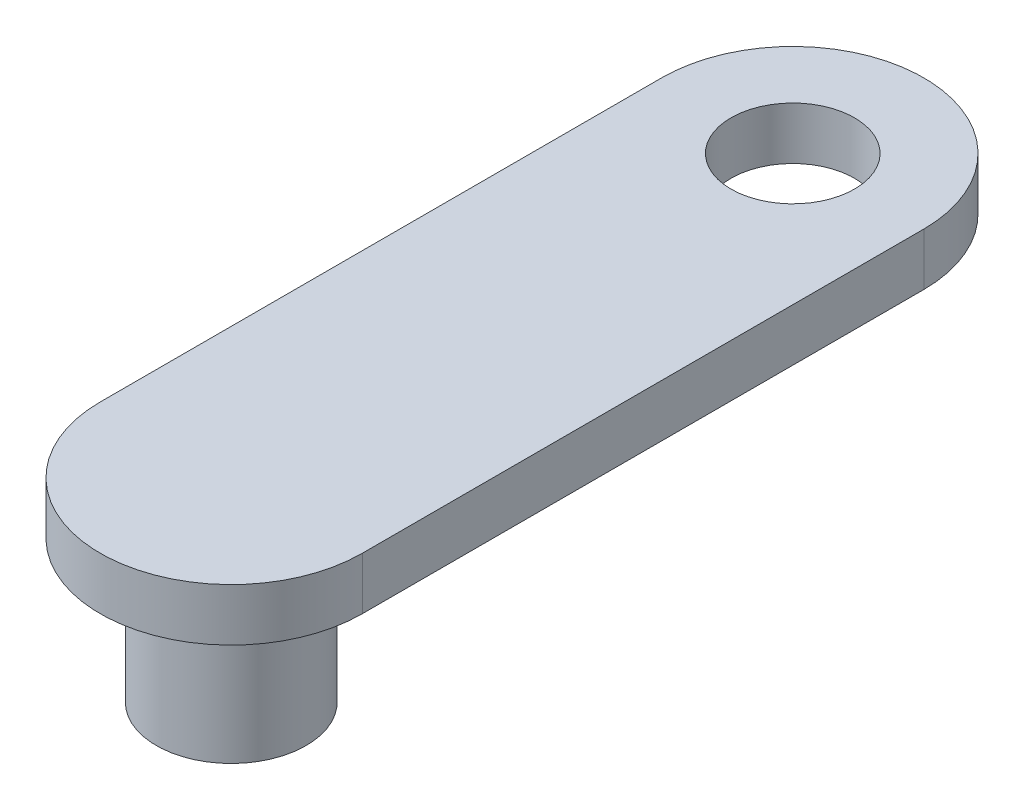
ISO-10303-21;
HEADER;
FILE_DESCRIPTION(('STEP AP214'),'2;1');
FILE_NAME('part.step','',(''),(''),'','','');
FILE_SCHEMA(('AUTOMOTIVE_DESIGN { 1 0 10303 214 1 1 1 1 }'));
ENDSEC;
DATA;
#1=APPLICATION_CONTEXT('core data for automotive mechanical design processes');
#2=APPLICATION_PROTOCOL_DEFINITION('international standard','automotive_design',2000,#1);
#3=PRODUCT_CONTEXT('',#1,'mechanical');
#4=PRODUCT('Part','Part','',(#3));
#5=PRODUCT_RELATED_PRODUCT_CATEGORY('part','',(#4));
#6=PRODUCT_DEFINITION_FORMATION('','',#4);
#7=PRODUCT_DEFINITION_CONTEXT('part definition',#1,'design');
#8=PRODUCT_DEFINITION('design','',#6,#7);
#9=PRODUCT_DEFINITION_SHAPE('','',#8);
#10=(LENGTH_UNIT() NAMED_UNIT(*) SI_UNIT(.MILLI.,.METRE.));
#11=(NAMED_UNIT(*) PLANE_ANGLE_UNIT() SI_UNIT($,.RADIAN.));
#12=(NAMED_UNIT(*) SI_UNIT($,.STERADIAN.) SOLID_ANGLE_UNIT());
#13=UNCERTAINTY_MEASURE_WITH_UNIT(LENGTH_MEASURE(1.E-05),#10,'distance_accuracy_value','');
#14=(GEOMETRIC_REPRESENTATION_CONTEXT(3) GLOBAL_UNCERTAINTY_ASSIGNED_CONTEXT((#13)) GLOBAL_UNIT_ASSIGNED_CONTEXT((#10,
#11,#12)) REPRESENTATION_CONTEXT('',''));
#15=CARTESIAN_POINT('',(0.,0.,0.));
#16=DIRECTION('',(0.,0.,1.));
#17=DIRECTION('',(1.,0.,0.));
#18=AXIS2_PLACEMENT_3D('',#15,#16,#17);
#19=CARTESIAN_POINT('',(0.,3.8,0.));
#20=DIRECTION('',(0.,-1.,0.));
#21=DIRECTION('',(0.,0.,-1.));
#22=AXIS2_PLACEMENT_3D('',#19,#20,#21);
#23=CYLINDRICAL_SURFACE('',#22,2.);
#24=CARTESIAN_POINT('',(0.,3.8,0.));
#25=DIRECTION('',(0.,1.,0.));
#26=DIRECTION('',(0.,0.,1.));
#27=AXIS2_PLACEMENT_3D('',#24,#25,#26);
#28=CIRCLE('',#27,2.);
#29=CARTESIAN_POINT('',(0.,3.8,-2.));
#30=VERTEX_POINT('',#29);
#31=EDGE_CURVE('E11',#30,#30,#28,.T.);
#32=CARTESIAN_POINT('',(0.,0.,0.));
#33=DIRECTION('',(0.,1.,0.));
#34=DIRECTION('',(0.,0.,1.));
#35=AXIS2_PLACEMENT_3D('',#32,#33,#34);
#36=CIRCLE('',#35,2.);
#37=CARTESIAN_POINT('',(0.,0.,-2.));
#38=VERTEX_POINT('',#37);
#39=EDGE_CURVE('E40',#38,#38,#36,.T.);
#40=CARTESIAN_POINT('',(0.,3.8,-2.));
#41=CARTESIAN_POINT('',(0.,3.76041666666667,-2.));
#42=CARTESIAN_POINT('',(0.,3.72083333333333,-2.));
#43=CARTESIAN_POINT('',(0.,3.64166666666667,-2.));
#44=CARTESIAN_POINT('',(0.,3.60208333333333,-2.));
#45=CARTESIAN_POINT('',(0.,3.52291666666667,-2.));
#46=CARTESIAN_POINT('',(0.,3.48333333333333,-2.));
#47=CARTESIAN_POINT('',(0.,3.40416666666667,-2.));
#48=CARTESIAN_POINT('',(0.,3.36458333333333,-2.));
#49=CARTESIAN_POINT('',(0.,3.28541666666667,-2.));
#50=CARTESIAN_POINT('',(0.,3.24583333333333,-2.));
#51=CARTESIAN_POINT('',(0.,3.16666666666667,-2.));
#52=CARTESIAN_POINT('',(0.,3.12708333333333,-2.));
#53=CARTESIAN_POINT('',(0.,3.04791666666667,-2.));
#54=CARTESIAN_POINT('',(0.,3.00833333333333,-2.));
#55=CARTESIAN_POINT('',(0.,2.92916666666667,-2.));
#56=CARTESIAN_POINT('',(0.,2.88958333333333,-2.));
#57=CARTESIAN_POINT('',(0.,2.81041666666667,-2.));
#58=CARTESIAN_POINT('',(0.,2.77083333333333,-2.));
#59=CARTESIAN_POINT('',(0.,2.69166666666667,-2.));
#60=CARTESIAN_POINT('',(0.,2.65208333333333,-2.));
#61=CARTESIAN_POINT('',(0.,2.57291666666667,-2.));
#62=CARTESIAN_POINT('',(0.,2.53333333333333,-2.));
#63=CARTESIAN_POINT('',(0.,2.45416666666667,-2.));
#64=CARTESIAN_POINT('',(0.,2.41458333333333,-2.));
#65=CARTESIAN_POINT('',(0.,2.33541666666667,-2.));
#66=CARTESIAN_POINT('',(0.,2.29583333333333,-2.));
#67=CARTESIAN_POINT('',(0.,2.21666666666667,-2.));
#68=CARTESIAN_POINT('',(0.,2.17708333333333,-2.));
#69=CARTESIAN_POINT('',(0.,2.09791666666667,-2.));
#70=CARTESIAN_POINT('',(0.,2.05833333333333,-2.));
#71=CARTESIAN_POINT('',(0.,1.97916666666667,-2.));
#72=CARTESIAN_POINT('',(0.,1.93958333333333,-2.));
#73=CARTESIAN_POINT('',(0.,1.86041666666667,-2.));
#74=CARTESIAN_POINT('',(0.,1.82083333333333,-2.));
#75=CARTESIAN_POINT('',(0.,1.74166666666667,-2.));
#76=CARTESIAN_POINT('',(0.,1.70208333333333,-2.));
#77=CARTESIAN_POINT('',(0.,1.62291666666667,-2.));
#78=CARTESIAN_POINT('',(0.,1.58333333333333,-2.));
#79=CARTESIAN_POINT('',(0.,1.50416666666667,-2.));
#80=CARTESIAN_POINT('',(0.,1.46458333333333,-2.));
#81=CARTESIAN_POINT('',(0.,1.38541666666667,-2.));
#82=CARTESIAN_POINT('',(0.,1.34583333333333,-2.));
#83=CARTESIAN_POINT('',(0.,1.26666666666667,-2.));
#84=CARTESIAN_POINT('',(0.,1.22708333333333,-2.));
#85=CARTESIAN_POINT('',(0.,1.14791666666667,-2.));
#86=CARTESIAN_POINT('',(0.,1.10833333333333,-2.));
#87=CARTESIAN_POINT('',(0.,1.02916666666667,-2.));
#88=CARTESIAN_POINT('',(0.,0.989583333333334,-2.));
#89=CARTESIAN_POINT('',(0.,0.910416666666667,-2.));
#90=CARTESIAN_POINT('',(0.,0.870833333333333,-2.));
#91=CARTESIAN_POINT('',(0.,0.791666666666667,-2.));
#92=CARTESIAN_POINT('',(0.,0.752083333333333,-2.));
#93=CARTESIAN_POINT('',(0.,0.672916666666667,-2.));
#94=CARTESIAN_POINT('',(0.,0.633333333333333,-2.));
#95=CARTESIAN_POINT('',(0.,0.554166666666667,-2.));
#96=CARTESIAN_POINT('',(0.,0.514583333333334,-2.));
#97=CARTESIAN_POINT('',(0.,0.435416666666667,-2.));
#98=CARTESIAN_POINT('',(0.,0.395833333333334,-2.));
#99=CARTESIAN_POINT('',(0.,0.316666666666667,-2.));
#100=CARTESIAN_POINT('',(0.,0.277083333333333,-2.));
#101=CARTESIAN_POINT('',(0.,0.197916666666667,-2.));
#102=CARTESIAN_POINT('',(0.,0.158333333333333,-2.));
#103=CARTESIAN_POINT('',(0.,0.0791666666666666,-2.));
#104=CARTESIAN_POINT('',(0.,0.0395833333333333,-2.));
#105=CARTESIAN_POINT('',(0.,0.,-2.));
#106=B_SPLINE_CURVE_WITH_KNOTS('',3,(#40,#41,#42,#43,#44,#45,#46,#47,#48,#49,#50,#51,#52,#53,
#54,#55,#56,#57,#58,#59,#60,#61,#62,#63,#64,#65,#66,#67,#68,#69,#70,#71,#72,#73,#74,#75,#76,#77,
#78,#79,#80,#81,#82,#83,#84,#85,#86,#87,#88,#89,#90,#91,#92,#93,#94,#95,#96,#97,#98,#99,#100,
#101,#102,#103,#104,#105),.UNSPECIFIED.,.F.,.F.,(4,2,2,2,2,2,2,2,2,2,2,2,2,2,2,2,2,2,2,2,2,2,2,
2,2,2,2,2,2,2,2,2,4),(0.,0.11875,0.2375,0.35625,0.475,0.59375,0.7125,0.83125,0.95,1.06875,
1.1875,1.30625,1.425,1.54375,1.6625,1.78125,1.9,2.01875,2.1375,2.25625,2.375,2.49375,2.6125,
2.73125,2.85,2.96875,3.0875,3.20625,3.325,3.44375,3.5625,3.68125,3.8),.UNSPECIFIED.);
#107=EDGE_CURVE('BSEAM37',#30,#38,#106,.T.);
#108=ORIENTED_EDGE('',*,*,#31,.F.);
#109=ORIENTED_EDGE('',*,*,#39,.T.);
#110=ORIENTED_EDGE('',*,*,#107,.T.);
#111=ORIENTED_EDGE('',*,*,#107,.F.);
#112=EDGE_LOOP('',(#108,#110,#109,#111));
#113=FACE_BOUND('',#112,.T.);
#114=ADVANCED_FACE('F37',(#113),#23,.T.);
#115=CARTESIAN_POINT('',(0.,0.,0.));
#116=DIRECTION('',(0.,1.,0.));
#117=DIRECTION('',(0.,0.,1.));
#118=AXIS2_PLACEMENT_3D('',#115,#116,#117);
#119=PLANE('',#118);
#120=ORIENTED_EDGE('',*,*,#39,.F.);
#121=EDGE_LOOP('',(#120));
#122=FACE_BOUND('',#121,.T.);
#123=ADVANCED_FACE('F118',(#122),#119,.F.);
#124=CARTESIAN_POINT('',(0.,5.2,0.));
#125=DIRECTION('',(0.,1.,0.));
#126=DIRECTION('',(0.,0.,1.));
#127=AXIS2_PLACEMENT_3D('',#124,#125,#126);
#128=PLANE('',#127);
#129=CARTESIAN_POINT('',(0.,5.2,0.));
#130=DIRECTION('',(0.,1.,0.));
#131=DIRECTION('',(0.,0.,1.));
#132=AXIS2_PLACEMENT_3D('',#129,#130,#131);
#133=CIRCLE('',#132,3.5);
#134=CARTESIAN_POINT('',(-3.5,5.2,0.));
#135=VERTEX_POINT('',#134);
#136=CARTESIAN_POINT('',(3.5,5.2,0.));
#137=VERTEX_POINT('',#136);
#138=EDGE_CURVE('E90',#135,#137,#133,.T.);
#139=ORIENTED_EDGE('',*,*,#138,.T.);
#140=DIRECTION('',(0.,0.,-1.));
#141=VECTOR('',#140,1.);
#142=CARTESIAN_POINT('',(3.5,5.2,0.));
#143=LINE('',#142,#141);
#144=CARTESIAN_POINT('',(3.5,5.2,-15.));
#145=VERTEX_POINT('',#144);
#146=EDGE_CURVE('E84',#137,#145,#143,.T.);
#147=ORIENTED_EDGE('',*,*,#146,.T.);
#148=CARTESIAN_POINT('',(0.,5.2,-15.));
#149=DIRECTION('',(0.,1.,0.));
#150=DIRECTION('',(0.,0.,1.));
#151=AXIS2_PLACEMENT_3D('',#148,#149,#150);
#152=CIRCLE('',#151,3.5);
#153=CARTESIAN_POINT('',(-3.5,5.2,-15.));
#154=VERTEX_POINT('',#153);
#155=EDGE_CURVE('E88',#145,#154,#152,.T.);
#156=ORIENTED_EDGE('',*,*,#155,.T.);
#157=DIRECTION('',(0.,0.,1.));
#158=VECTOR('',#157,1.);
#159=CARTESIAN_POINT('',(-3.5,5.2,0.));
#160=LINE('',#159,#158);
#161=EDGE_CURVE('E53',#154,#135,#160,.T.);
#162=ORIENTED_EDGE('',*,*,#161,.T.);
#163=EDGE_LOOP('',(#139,#147,#156,#162));
#164=FACE_BOUND('',#163,.T.);
#165=CARTESIAN_POINT('',(0.,5.2,-15.));
#166=DIRECTION('',(0.,1.,0.));
#167=DIRECTION('',(0.,0.,1.));
#168=AXIS2_PLACEMENT_3D('',#165,#166,#167);
#169=CIRCLE('',#168,1.65);
#170=CARTESIAN_POINT('',(0.,5.2,-13.35));
#171=VERTEX_POINT('',#170);
#172=EDGE_CURVE('E108',#171,#171,#169,.T.);
#173=ORIENTED_EDGE('',*,*,#172,.F.);
#174=EDGE_LOOP('',(#173));
#175=FACE_BOUND('',#174,.T.);
#176=ADVANCED_FACE('F85',(#164,#175),#128,.T.);
#177=CARTESIAN_POINT('',(0.,3.8,0.));
#178=DIRECTION('',(0.,1.,0.));
#179=DIRECTION('',(0.,0.,1.));
#180=AXIS2_PLACEMENT_3D('',#177,#178,#179);
#181=PLANE('',#180);
#182=ORIENTED_EDGE('',*,*,#31,.T.);
#183=EDGE_LOOP('',(#182));
#184=FACE_BOUND('',#183,.T.);
#185=CARTESIAN_POINT('',(0.,3.8,0.));
#186=DIRECTION('',(0.,1.,0.));
#187=DIRECTION('',(0.,0.,1.));
#188=AXIS2_PLACEMENT_3D('',#185,#186,#187);
#189=CIRCLE('',#188,3.5);
#190=CARTESIAN_POINT('',(-3.5,3.8,0.));
#191=VERTEX_POINT('',#190);
#192=CARTESIAN_POINT('',(3.5,3.8,0.));
#193=VERTEX_POINT('',#192);
#194=EDGE_CURVE('E105',#191,#193,#189,.T.);
#195=ORIENTED_EDGE('',*,*,#194,.F.);
#196=DIRECTION('',(0.,0.,1.));
#197=VECTOR('',#196,1.);
#198=CARTESIAN_POINT('',(-3.5,3.8,0.));
#199=LINE('',#198,#197);
#200=CARTESIAN_POINT('',(-3.5,3.8,-15.));
#201=VERTEX_POINT('',#200);
#202=EDGE_CURVE('E76',#201,#191,#199,.T.);
#203=ORIENTED_EDGE('',*,*,#202,.F.);
#204=CARTESIAN_POINT('',(0.,3.8,-15.));
#205=DIRECTION('',(0.,1.,0.));
#206=DIRECTION('',(0.,0.,1.));
#207=AXIS2_PLACEMENT_3D('',#204,#205,#206);
#208=CIRCLE('',#207,3.5);
#209=CARTESIAN_POINT('',(3.5,3.8,-15.));
#210=VERTEX_POINT('',#209);
#211=EDGE_CURVE('E70',#210,#201,#208,.T.);
#212=ORIENTED_EDGE('',*,*,#211,.F.);
#213=DIRECTION('',(0.,0.,-1.));
#214=VECTOR('',#213,1.);
#215=CARTESIAN_POINT('',(3.5,3.8,0.));
#216=LINE('',#215,#214);
#217=EDGE_CURVE('E95',#193,#210,#216,.T.);
#218=ORIENTED_EDGE('',*,*,#217,.F.);
#219=EDGE_LOOP('',(#195,#203,#212,#218));
#220=FACE_BOUND('',#219,.T.);
#221=CARTESIAN_POINT('',(0.,3.8,-15.));
#222=DIRECTION('',(0.,1.,0.));
#223=DIRECTION('',(0.,0.,1.));
#224=AXIS2_PLACEMENT_3D('',#221,#222,#223);
#225=CIRCLE('',#224,1.65);
#226=CARTESIAN_POINT('',(0.,3.8,-13.35));
#227=VERTEX_POINT('',#226);
#228=EDGE_CURVE('E152',#227,#227,#225,.T.);
#229=ORIENTED_EDGE('',*,*,#228,.T.);
#230=EDGE_LOOP('',(#229));
#231=FACE_BOUND('',#230,.T.);
#232=ADVANCED_FACE('F124',(#184,#220,#231),#181,.F.);
#233=CARTESIAN_POINT('',(0.,5.2,0.));
#234=DIRECTION('',(0.,-1.,0.));
#235=DIRECTION('',(0.,0.,-1.));
#236=AXIS2_PLACEMENT_3D('',#233,#234,#235);
#237=CYLINDRICAL_SURFACE('',#236,3.5);
#238=ORIENTED_EDGE('',*,*,#194,.T.);
#239=DIRECTION('',(0.,-1.,0.));
#240=VECTOR('',#239,1.);
#241=CARTESIAN_POINT('',(3.5,5.2,0.));
#242=LINE('',#241,#240);
#243=EDGE_CURVE('E96',#137,#193,#242,.T.);
#244=ORIENTED_EDGE('',*,*,#243,.F.);
#245=ORIENTED_EDGE('',*,*,#138,.F.);
#246=DIRECTION('',(0.,-1.,0.));
#247=VECTOR('',#246,1.);
#248=CARTESIAN_POINT('',(-3.5,5.2,0.));
#249=LINE('',#248,#247);
#250=EDGE_CURVE('E101',#135,#191,#249,.T.);
#251=ORIENTED_EDGE('',*,*,#250,.T.);
#252=EDGE_LOOP('',(#238,#244,#245,#251));
#253=FACE_BOUND('',#252,.T.);
#254=ADVANCED_FACE('F128',(#253),#237,.T.);
#255=CARTESIAN_POINT('',(3.5,5.2,0.));
#256=DIRECTION('',(-1.,0.,0.));
#257=DIRECTION('',(0.,0.,1.));
#258=AXIS2_PLACEMENT_3D('',#255,#256,#257);
#259=PLANE('',#258);
#260=ORIENTED_EDGE('',*,*,#217,.T.);
#261=DIRECTION('',(0.,-1.,0.));
#262=VECTOR('',#261,1.);
#263=CARTESIAN_POINT('',(3.5,5.2,-15.));
#264=LINE('',#263,#262);
#265=EDGE_CURVE('E93',#145,#210,#264,.T.);
#266=ORIENTED_EDGE('',*,*,#265,.F.);
#267=ORIENTED_EDGE('',*,*,#146,.F.);
#268=ORIENTED_EDGE('',*,*,#243,.T.);
#269=EDGE_LOOP('',(#260,#266,#267,#268));
#270=FACE_BOUND('',#269,.T.);
#271=ADVANCED_FACE('F94',(#270),#259,.F.);
#272=CARTESIAN_POINT('',(0.,5.2,-15.));
#273=DIRECTION('',(0.,-1.,0.));
#274=DIRECTION('',(0.,0.,-1.));
#275=AXIS2_PLACEMENT_3D('',#272,#273,#274);
#276=CYLINDRICAL_SURFACE('',#275,3.5);
#277=ORIENTED_EDGE('',*,*,#211,.T.);
#278=DIRECTION('',(0.,-1.,0.));
#279=VECTOR('',#278,1.);
#280=CARTESIAN_POINT('',(-3.5,5.2,-15.));
#281=LINE('',#280,#279);
#282=EDGE_CURVE('E97',#154,#201,#281,.T.);
#283=ORIENTED_EDGE('',*,*,#282,.F.);
#284=ORIENTED_EDGE('',*,*,#155,.F.);
#285=ORIENTED_EDGE('',*,*,#265,.T.);
#286=EDGE_LOOP('',(#277,#283,#284,#285));
#287=FACE_BOUND('',#286,.T.);
#288=ADVANCED_FACE('F99',(#287),#276,.T.);
#289=CARTESIAN_POINT('',(-3.5,5.2,0.));
#290=DIRECTION('',(1.,0.,0.));
#291=DIRECTION('',(0.,0.,-1.));
#292=AXIS2_PLACEMENT_3D('',#289,#290,#291);
#293=PLANE('',#292);
#294=ORIENTED_EDGE('',*,*,#202,.T.);
#295=ORIENTED_EDGE('',*,*,#250,.F.);
#296=ORIENTED_EDGE('',*,*,#161,.F.);
#297=ORIENTED_EDGE('',*,*,#282,.T.);
#298=EDGE_LOOP('',(#294,#295,#296,#297));
#299=FACE_BOUND('',#298,.T.);
#300=ADVANCED_FACE('F136',(#299),#293,.F.);
#301=CARTESIAN_POINT('',(0.,5.2,-15.));
#302=DIRECTION('',(0.,-1.,0.));
#303=DIRECTION('',(0.,0.,-1.));
#304=AXIS2_PLACEMENT_3D('',#301,#302,#303);
#305=CYLINDRICAL_SURFACE('',#304,1.65);
#306=ORIENTED_EDGE('',*,*,#172,.T.);
#307=EDGE_LOOP('',(#306));
#308=FACE_BOUND('',#307,.T.);
#309=ORIENTED_EDGE('',*,*,#228,.F.);
#310=EDGE_LOOP('',(#309));
#311=FACE_BOUND('',#310,.T.);
#312=ADVANCED_FACE('F139',(#308,#311),#305,.F.);
#313=CLOSED_SHELL('',(#114,#123,#176,#232,#254,#271,#288,#300,#312));
#314=MANIFOLD_SOLID_BREP('B2',#313);
#315=ADVANCED_BREP_SHAPE_REPRESENTATION('',(#18,#314),#14);
#316=SHAPE_DEFINITION_REPRESENTATION(#9,#315);
ENDSEC;
END-ISO-10303-21;
